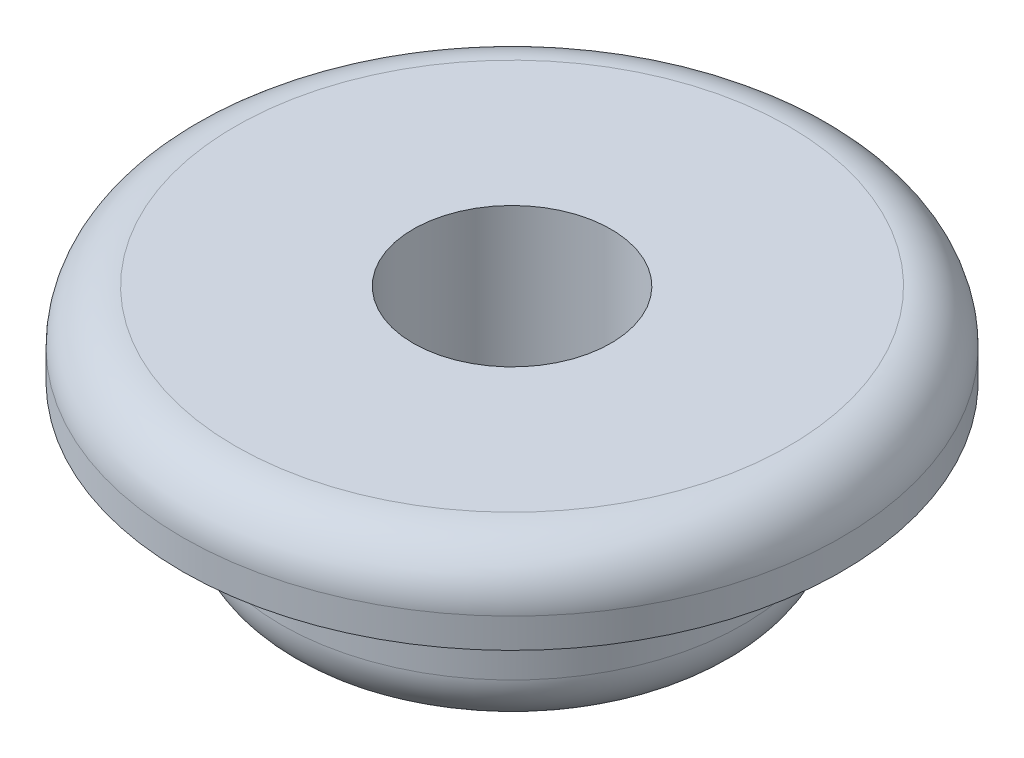
ISO-10303-21;
HEADER;
FILE_DESCRIPTION(('STEP AP214'),'2;1');
FILE_NAME('part.step','',(''),(''),'','','');
FILE_SCHEMA(('AUTOMOTIVE_DESIGN { 1 0 10303 214 1 1 1 1 }'));
ENDSEC;
DATA;
#1=APPLICATION_CONTEXT('core data for automotive mechanical design processes');
#2=APPLICATION_PROTOCOL_DEFINITION('international standard','automotive_design',2000,#1);
#3=PRODUCT_CONTEXT('',#1,'mechanical');
#4=PRODUCT('Part','Part','',(#3));
#5=PRODUCT_RELATED_PRODUCT_CATEGORY('part','',(#4));
#6=PRODUCT_DEFINITION_FORMATION('','',#4);
#7=PRODUCT_DEFINITION_CONTEXT('part definition',#1,'design');
#8=PRODUCT_DEFINITION('design','',#6,#7);
#9=PRODUCT_DEFINITION_SHAPE('','',#8);
#10=(LENGTH_UNIT() NAMED_UNIT(*) SI_UNIT(.MILLI.,.METRE.));
#11=(NAMED_UNIT(*) PLANE_ANGLE_UNIT() SI_UNIT($,.RADIAN.));
#12=(NAMED_UNIT(*) SI_UNIT($,.STERADIAN.) SOLID_ANGLE_UNIT());
#13=UNCERTAINTY_MEASURE_WITH_UNIT(LENGTH_MEASURE(1.E-05),#10,'distance_accuracy_value','');
#14=(GEOMETRIC_REPRESENTATION_CONTEXT(3) GLOBAL_UNCERTAINTY_ASSIGNED_CONTEXT((#13)) GLOBAL_UNIT_ASSIGNED_CONTEXT((#10,
#11,#12)) REPRESENTATION_CONTEXT('',''));
#15=CARTESIAN_POINT('',(0.,0.,0.));
#16=DIRECTION('',(0.,0.,1.));
#17=DIRECTION('',(1.,0.,0.));
#18=AXIS2_PLACEMENT_3D('',#15,#16,#17);
#19=CARTESIAN_POINT('',(0.,2.778125,0.));
#20=DIRECTION('',(0.,-1.,0.));
#21=DIRECTION('',(0.,0.,-1.));
#22=AXIS2_PLACEMENT_3D('',#19,#20,#21);
#23=CYLINDRICAL_SURFACE('',#22,5.55625);
#24=CARTESIAN_POINT('',(0.,-1.508125,0.));
#25=DIRECTION('',(0.,1.,0.));
#26=DIRECTION('',(0.,0.,1.));
#27=AXIS2_PLACEMENT_3D('',#24,#25,#26);
#28=CIRCLE('',#27,5.55625);
#29=CARTESIAN_POINT('',(0.,-1.508125,5.55625));
#30=VERTEX_POINT('',#29);
#31=EDGE_CURVE('E38',#30,#30,#28,.T.);
#32=ORIENTED_EDGE('',*,*,#31,.T.);
#33=EDGE_LOOP('',(#32));
#34=FACE_BOUND('',#33,.T.);
#35=CARTESIAN_POINT('',(0.,-0.79375,0.));
#36=DIRECTION('',(0.,1.,0.));
#37=DIRECTION('',(0.,0.,1.));
#38=AXIS2_PLACEMENT_3D('',#35,#36,#37);
#39=CIRCLE('',#38,5.55625);
#40=CARTESIAN_POINT('',(0.,-0.79375,5.55625));
#41=VERTEX_POINT('',#40);
#42=EDGE_CURVE('E51',#41,#41,#39,.T.);
#43=ORIENTED_EDGE('',*,*,#42,.F.);
#44=EDGE_LOOP('',(#43));
#45=FACE_BOUND('',#44,.T.);
#46=ADVANCED_FACE('F31',(#34,#45),#23,.T.);
#47=CARTESIAN_POINT('',(0.,-2.778125,0.));
#48=DIRECTION('',(0.,1.,0.));
#49=DIRECTION('',(0.,0.,1.));
#50=AXIS2_PLACEMENT_3D('',#47,#48,#49);
#51=PLANE('',#50);
#52=CARTESIAN_POINT('',(0.,-2.778125,0.));
#53=DIRECTION('',(0.,1.,0.));
#54=DIRECTION('',(0.,0.,1.));
#55=AXIS2_PLACEMENT_3D('',#52,#53,#54);
#56=CIRCLE('',#55,4.28625);
#57=CARTESIAN_POINT('',(0.,-2.778125,4.28625));
#58=VERTEX_POINT('',#57);
#59=EDGE_CURVE('E10',#58,#58,#56,.F.);
#60=ORIENTED_EDGE('',*,*,#59,.T.);
#61=EDGE_LOOP('',(#60));
#62=FACE_BOUND('',#61,.T.);
#63=CARTESIAN_POINT('',(0.,-2.778125,0.));
#64=DIRECTION('',(0.,1.,0.));
#65=DIRECTION('',(0.,0.,1.));
#66=AXIS2_PLACEMENT_3D('',#63,#64,#65);
#67=CIRCLE('',#66,2.38125);
#68=CARTESIAN_POINT('',(0.,-2.778125,2.38125));
#69=VERTEX_POINT('',#68);
#70=EDGE_CURVE('E61',#69,#69,#67,.T.);
#71=ORIENTED_EDGE('',*,*,#70,.T.);
#72=EDGE_LOOP('',(#71));
#73=FACE_BOUND('',#72,.T.);
#74=ADVANCED_FACE('F70',(#62,#73),#51,.F.);
#75=CARTESIAN_POINT('',(0.,-0.79375,0.));
#76=DIRECTION('',(0.,1.,0.));
#77=DIRECTION('',(0.,0.,1.));
#78=AXIS2_PLACEMENT_3D('',#75,#76,#77);
#79=PLANE('',#78);
#80=CARTESIAN_POINT('',(0.,-0.79375,0.));
#81=DIRECTION('',(0.,1.,0.));
#82=DIRECTION('',(0.,0.,1.));
#83=AXIS2_PLACEMENT_3D('',#80,#81,#82);
#84=CIRCLE('',#83,3.96875);
#85=CARTESIAN_POINT('',(0.,-0.79375,3.96875));
#86=VERTEX_POINT('',#85);
#87=EDGE_CURVE('E57',#86,#86,#84,.T.);
#88=ORIENTED_EDGE('',*,*,#87,.F.);
#89=EDGE_LOOP('',(#88));
#90=FACE_BOUND('',#89,.T.);
#91=ORIENTED_EDGE('',*,*,#42,.T.);
#92=EDGE_LOOP('',(#91));
#93=FACE_BOUND('',#92,.T.);
#94=ADVANCED_FACE('F100',(#90,#93),#79,.T.);
#95=CARTESIAN_POINT('',(0.,0.79375,0.));
#96=DIRECTION('',(0.,1.,0.));
#97=DIRECTION('',(0.,0.,1.));
#98=AXIS2_PLACEMENT_3D('',#95,#96,#97);
#99=PLANE('',#98);
#100=CARTESIAN_POINT('',(0.,0.79375,0.));
#101=DIRECTION('',(0.,1.,0.));
#102=DIRECTION('',(0.,0.,1.));
#103=AXIS2_PLACEMENT_3D('',#100,#101,#102);
#104=CIRCLE('',#103,7.9375);
#105=CARTESIAN_POINT('',(0.,0.79375,7.9375));
#106=VERTEX_POINT('',#105);
#107=EDGE_CURVE('E54',#106,#106,#104,.F.);
#108=ORIENTED_EDGE('',*,*,#107,.T.);
#109=EDGE_LOOP('',(#108));
#110=FACE_BOUND('',#109,.T.);
#111=CARTESIAN_POINT('',(0.,0.79375,0.));
#112=DIRECTION('',(0.,1.,0.));
#113=DIRECTION('',(0.,0.,1.));
#114=AXIS2_PLACEMENT_3D('',#111,#112,#113);
#115=CIRCLE('',#114,3.96875);
#116=CARTESIAN_POINT('',(0.,0.79375,3.96875));
#117=VERTEX_POINT('',#116);
#118=EDGE_CURVE('E58',#117,#117,#115,.T.);
#119=ORIENTED_EDGE('',*,*,#118,.T.);
#120=EDGE_LOOP('',(#119));
#121=FACE_BOUND('',#120,.T.);
#122=ADVANCED_FACE('F91',(#110,#121),#99,.F.);
#123=CARTESIAN_POINT('',(0.,-0.79375,0.));
#124=DIRECTION('',(0.,1.,0.));
#125=DIRECTION('',(0.,0.,1.));
#126=AXIS2_PLACEMENT_3D('',#123,#124,#125);
#127=CYLINDRICAL_SURFACE('',#126,3.96875);
#128=ORIENTED_EDGE('',*,*,#87,.T.);
#129=EDGE_LOOP('',(#128));
#130=FACE_BOUND('',#129,.T.);
#131=ORIENTED_EDGE('',*,*,#118,.F.);
#132=EDGE_LOOP('',(#131));
#133=FACE_BOUND('',#132,.T.);
#134=ADVANCED_FACE('F82',(#130,#133),#127,.T.);
#135=CARTESIAN_POINT('',(0.,2.778125,0.));
#136=DIRECTION('',(0.,1.,0.));
#137=DIRECTION('',(0.,0.,1.));
#138=AXIS2_PLACEMENT_3D('',#135,#136,#137);
#139=PLANE('',#138);
#140=CARTESIAN_POINT('',(0.,2.778125,0.));
#141=DIRECTION('',(0.,1.,0.));
#142=DIRECTION('',(0.,0.,1.));
#143=AXIS2_PLACEMENT_3D('',#140,#141,#142);
#144=CIRCLE('',#143,6.6675);
#145=CARTESIAN_POINT('',(0.,2.778125,6.6675));
#146=VERTEX_POINT('',#145);
#147=EDGE_CURVE('E46',#146,#146,#144,.T.);
#148=ORIENTED_EDGE('',*,*,#147,.T.);
#149=EDGE_LOOP('',(#148));
#150=FACE_BOUND('',#149,.T.);
#151=CARTESIAN_POINT('',(0.,2.778125,0.));
#152=DIRECTION('',(0.,1.,0.));
#153=DIRECTION('',(0.,0.,1.));
#154=AXIS2_PLACEMENT_3D('',#151,#152,#153);
#155=CIRCLE('',#154,2.38125);
#156=CARTESIAN_POINT('',(0.,2.778125,2.38125));
#157=VERTEX_POINT('',#156);
#158=EDGE_CURVE('E64',#157,#157,#155,.T.);
#159=ORIENTED_EDGE('',*,*,#158,.F.);
#160=EDGE_LOOP('',(#159));
#161=FACE_BOUND('',#160,.T.);
#162=ADVANCED_FACE('F80',(#150,#161),#139,.T.);
#163=CARTESIAN_POINT('',(0.,0.238125,0.));
#164=DIRECTION('',(0.,1.,0.));
#165=DIRECTION('',(0.,0.,1.));
#166=AXIS2_PLACEMENT_3D('',#163,#164,#165);
#167=CYLINDRICAL_SURFACE('',#166,7.9375);
#168=CARTESIAN_POINT('',(0.,1.508125,0.));
#169=DIRECTION('',(0.,1.,0.));
#170=DIRECTION('',(0.,0.,1.));
#171=AXIS2_PLACEMENT_3D('',#168,#169,#170);
#172=CIRCLE('',#171,7.9375);
#173=CARTESIAN_POINT('',(0.,1.508125,7.9375));
#174=VERTEX_POINT('',#173);
#175=EDGE_CURVE('E42',#174,#174,#172,.F.);
#176=ORIENTED_EDGE('',*,*,#175,.T.);
#177=EDGE_LOOP('',(#176));
#178=FACE_BOUND('',#177,.T.);
#179=ORIENTED_EDGE('',*,*,#107,.F.);
#180=EDGE_LOOP('',(#179));
#181=FACE_BOUND('',#180,.T.);
#182=ADVANCED_FACE('F76',(#178,#181),#167,.T.);
#183=CARTESIAN_POINT('',(0.,-2.778125,0.));
#184=DIRECTION('',(0.,1.,0.));
#185=DIRECTION('',(0.,0.,1.));
#186=AXIS2_PLACEMENT_3D('',#183,#184,#185);
#187=CYLINDRICAL_SURFACE('',#186,2.38125);
#188=ORIENTED_EDGE('',*,*,#70,.F.);
#189=EDGE_LOOP('',(#188));
#190=FACE_BOUND('',#189,.T.);
#191=ORIENTED_EDGE('',*,*,#158,.T.);
#192=EDGE_LOOP('',(#191));
#193=FACE_BOUND('',#192,.T.);
#194=ADVANCED_FACE('F72',(#190,#193),#187,.F.);
#195=CARTESIAN_POINT('',(0.,1.508125,0.));
#196=DIRECTION('',(0.,1.,0.));
#197=DIRECTION('',(0.,0.,1.));
#198=AXIS2_PLACEMENT_3D('',#195,#196,#197);
#199=TOROIDAL_SURFACE('',#198,6.6675,1.27);
#200=ORIENTED_EDGE('',*,*,#175,.F.);
#201=EDGE_LOOP('',(#200));
#202=FACE_BOUND('',#201,.T.);
#203=ORIENTED_EDGE('',*,*,#147,.F.);
#204=EDGE_LOOP('',(#203));
#205=FACE_BOUND('',#204,.T.);
#206=ADVANCED_FACE('F75',(#202,#205),#199,.T.);
#207=CARTESIAN_POINT('',(0.,-1.508125,0.));
#208=DIRECTION('',(0.,1.,0.));
#209=DIRECTION('',(0.,0.,1.));
#210=AXIS2_PLACEMENT_3D('',#207,#208,#209);
#211=TOROIDAL_SURFACE('',#210,4.28625,1.27);
#212=ORIENTED_EDGE('',*,*,#59,.F.);
#213=EDGE_LOOP('',(#212));
#214=FACE_BOUND('',#213,.T.);
#215=ORIENTED_EDGE('',*,*,#31,.F.);
#216=EDGE_LOOP('',(#215));
#217=FACE_BOUND('',#216,.T.);
#218=ADVANCED_FACE('F33',(#214,#217),#211,.T.);
#219=CLOSED_SHELL('',(#46,#74,#94,#122,#134,#162,#182,#194,#206,#218));
#220=MANIFOLD_SOLID_BREP('B2',#219);
#221=ADVANCED_BREP_SHAPE_REPRESENTATION('',(#18,#220),#14);
#222=SHAPE_DEFINITION_REPRESENTATION(#9,#221);
ENDSEC;
END-ISO-10303-21;
